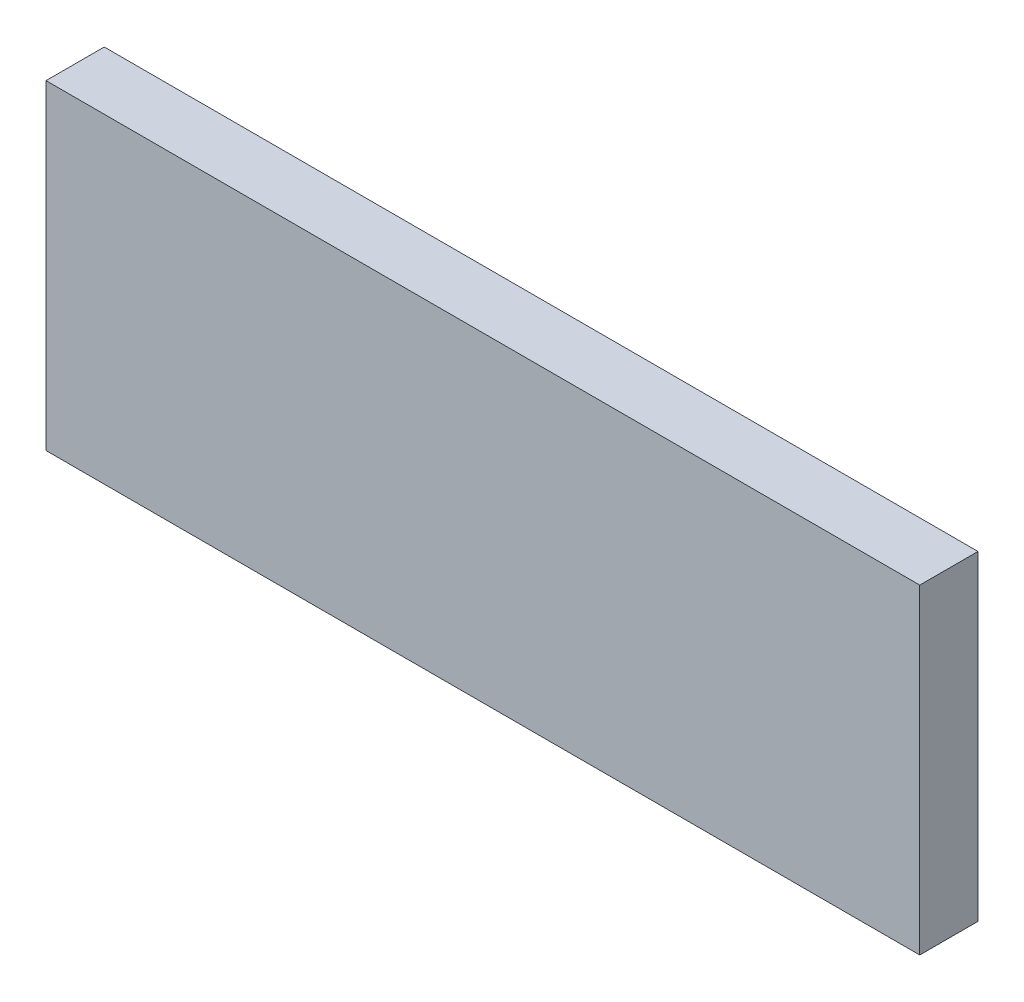
ISO-10303-21;
HEADER;
FILE_DESCRIPTION(('STEP AP214'),'2;1');
FILE_NAME('part.step','',(''),(''),'','','');
FILE_SCHEMA(('AUTOMOTIVE_DESIGN { 1 0 10303 214 1 1 1 1 }'));
ENDSEC;
DATA;
#1=APPLICATION_CONTEXT('core data for automotive mechanical design processes');
#2=APPLICATION_PROTOCOL_DEFINITION('international standard','automotive_design',2000,#1);
#3=PRODUCT_CONTEXT('',#1,'mechanical');
#4=PRODUCT('Part','Part','',(#3));
#5=PRODUCT_RELATED_PRODUCT_CATEGORY('part','',(#4));
#6=PRODUCT_DEFINITION_FORMATION('','',#4);
#7=PRODUCT_DEFINITION_CONTEXT('part definition',#1,'design');
#8=PRODUCT_DEFINITION('design','',#6,#7);
#9=PRODUCT_DEFINITION_SHAPE('','',#8);
#10=(LENGTH_UNIT() NAMED_UNIT(*) SI_UNIT(.MILLI.,.METRE.));
#11=(NAMED_UNIT(*) PLANE_ANGLE_UNIT() SI_UNIT($,.RADIAN.));
#12=(NAMED_UNIT(*) SI_UNIT($,.STERADIAN.) SOLID_ANGLE_UNIT());
#13=UNCERTAINTY_MEASURE_WITH_UNIT(LENGTH_MEASURE(1.E-05),#10,'distance_accuracy_value','');
#14=(GEOMETRIC_REPRESENTATION_CONTEXT(3) GLOBAL_UNCERTAINTY_ASSIGNED_CONTEXT((#13)) GLOBAL_UNIT_ASSIGNED_CONTEXT((#10,
#11,#12)) REPRESENTATION_CONTEXT('',''));
#15=CARTESIAN_POINT('',(0.,0.,0.));
#16=DIRECTION('',(0.,0.,1.));
#17=DIRECTION('',(1.,0.,0.));
#18=AXIS2_PLACEMENT_3D('',#15,#16,#17);
#19=CARTESIAN_POINT('',(-51.24,31.58,2.));
#20=DIRECTION('',(1.,0.,0.));
#21=DIRECTION('',(0.,1.,0.));
#22=AXIS2_PLACEMENT_3D('',#19,#20,#21);
#23=PLANE('',#22);
#24=DIRECTION('',(0.,-1.,0.));
#25=VECTOR('',#24,1.);
#26=CARTESIAN_POINT('',(-51.24,31.58,0.));
#27=LINE('',#26,#25);
#28=CARTESIAN_POINT('',(-51.24,31.58,0.));
#29=VERTEX_POINT('',#28);
#30=CARTESIAN_POINT('',(-51.24,20.58,0.));
#31=VERTEX_POINT('',#30);
#32=EDGE_CURVE('E96',#29,#31,#27,.T.);
#33=ORIENTED_EDGE('',*,*,#32,.T.);
#34=DIRECTION('',(0.,0.,-1.));
#35=VECTOR('',#34,1.);
#36=CARTESIAN_POINT('',(-51.24,20.58,2.));
#37=LINE('',#36,#35);
#38=CARTESIAN_POINT('',(-51.24,20.58,2.));
#39=VERTEX_POINT('',#38);
#40=EDGE_CURVE('E11',#39,#31,#37,.T.);
#41=ORIENTED_EDGE('',*,*,#40,.F.);
#42=DIRECTION('',(0.,-1.,0.));
#43=VECTOR('',#42,1.);
#44=CARTESIAN_POINT('',(-51.24,31.58,2.));
#45=LINE('',#44,#43);
#46=CARTESIAN_POINT('',(-51.24,31.58,2.));
#47=VERTEX_POINT('',#46);
#48=EDGE_CURVE('E84',#47,#39,#45,.T.);
#49=ORIENTED_EDGE('',*,*,#48,.F.);
#50=DIRECTION('',(0.,0.,-1.));
#51=VECTOR('',#50,1.);
#52=CARTESIAN_POINT('',(-51.24,31.58,2.));
#53=LINE('',#52,#51);
#54=EDGE_CURVE('E92',#47,#29,#53,.T.);
#55=ORIENTED_EDGE('',*,*,#54,.T.);
#56=EDGE_LOOP('',(#33,#41,#49,#55));
#57=FACE_BOUND('',#56,.T.);
#58=ADVANCED_FACE('F33',(#57),#23,.F.);
#59=CARTESIAN_POINT('',(-51.24,20.58,2.));
#60=DIRECTION('',(0.,1.,0.));
#61=DIRECTION('',(0.,0.,1.));
#62=AXIS2_PLACEMENT_3D('',#59,#60,#61);
#63=PLANE('',#62);
#64=DIRECTION('',(1.,0.,0.));
#65=VECTOR('',#64,1.);
#66=CARTESIAN_POINT('',(-51.24,20.58,0.));
#67=LINE('',#66,#65);
#68=CARTESIAN_POINT('',(-21.24,20.58,0.));
#69=VERTEX_POINT('',#68);
#70=EDGE_CURVE('E88',#31,#69,#67,.T.);
#71=ORIENTED_EDGE('',*,*,#70,.T.);
#72=DIRECTION('',(0.,0.,-1.));
#73=VECTOR('',#72,1.);
#74=CARTESIAN_POINT('',(-21.24,20.58,2.));
#75=LINE('',#74,#73);
#76=CARTESIAN_POINT('',(-21.24,20.58,2.));
#77=VERTEX_POINT('',#76);
#78=EDGE_CURVE('E41',#77,#69,#75,.T.);
#79=ORIENTED_EDGE('',*,*,#78,.F.);
#80=DIRECTION('',(1.,0.,0.));
#81=VECTOR('',#80,1.);
#82=CARTESIAN_POINT('',(-51.24,20.58,2.));
#83=LINE('',#82,#81);
#84=EDGE_CURVE('E79',#39,#77,#83,.T.);
#85=ORIENTED_EDGE('',*,*,#84,.F.);
#86=ORIENTED_EDGE('',*,*,#40,.T.);
#87=EDGE_LOOP('',(#71,#79,#85,#86));
#88=FACE_BOUND('',#87,.T.);
#89=ADVANCED_FACE('F87',(#88),#63,.F.);
#90=CARTESIAN_POINT('',(-21.24,31.58,2.));
#91=DIRECTION('',(-1.,0.,0.));
#92=DIRECTION('',(0.,0.,1.));
#93=AXIS2_PLACEMENT_3D('',#90,#91,#92);
#94=PLANE('',#93);
#95=DIRECTION('',(0.,1.,0.));
#96=VECTOR('',#95,1.);
#97=CARTESIAN_POINT('',(-21.24,31.58,0.));
#98=LINE('',#97,#96);
#99=CARTESIAN_POINT('',(-21.24,31.58,0.));
#100=VERTEX_POINT('',#99);
#101=EDGE_CURVE('E66',#69,#100,#98,.T.);
#102=ORIENTED_EDGE('',*,*,#101,.T.);
#103=DIRECTION('',(0.,0.,-1.));
#104=VECTOR('',#103,1.);
#105=CARTESIAN_POINT('',(-21.24,31.58,2.));
#106=LINE('',#105,#104);
#107=CARTESIAN_POINT('',(-21.24,31.58,2.));
#108=VERTEX_POINT('',#107);
#109=EDGE_CURVE('E89',#108,#100,#106,.T.);
#110=ORIENTED_EDGE('',*,*,#109,.F.);
#111=DIRECTION('',(0.,1.,0.));
#112=VECTOR('',#111,1.);
#113=CARTESIAN_POINT('',(-21.24,31.58,2.));
#114=LINE('',#113,#112);
#115=EDGE_CURVE('E82',#77,#108,#114,.T.);
#116=ORIENTED_EDGE('',*,*,#115,.F.);
#117=ORIENTED_EDGE('',*,*,#78,.T.);
#118=EDGE_LOOP('',(#102,#110,#116,#117));
#119=FACE_BOUND('',#118,.T.);
#120=ADVANCED_FACE('F90',(#119),#94,.F.);
#121=CARTESIAN_POINT('',(-51.24,31.58,2.));
#122=DIRECTION('',(0.,-1.,0.));
#123=DIRECTION('',(0.,0.,-1.));
#124=AXIS2_PLACEMENT_3D('',#121,#122,#123);
#125=PLANE('',#124);
#126=DIRECTION('',(-1.,0.,0.));
#127=VECTOR('',#126,1.);
#128=CARTESIAN_POINT('',(-51.24,31.58,0.));
#129=LINE('',#128,#127);
#130=EDGE_CURVE('E72',#100,#29,#129,.T.);
#131=ORIENTED_EDGE('',*,*,#130,.T.);
#132=ORIENTED_EDGE('',*,*,#54,.F.);
#133=DIRECTION('',(-1.,0.,0.));
#134=VECTOR('',#133,1.);
#135=CARTESIAN_POINT('',(-51.24,31.58,2.));
#136=LINE('',#135,#134);
#137=EDGE_CURVE('E49',#108,#47,#136,.T.);
#138=ORIENTED_EDGE('',*,*,#137,.F.);
#139=ORIENTED_EDGE('',*,*,#109,.T.);
#140=EDGE_LOOP('',(#131,#132,#138,#139));
#141=FACE_BOUND('',#140,.T.);
#142=ADVANCED_FACE('F103',(#141),#125,.F.);
#143=CARTESIAN_POINT('',(0.,0.,2.));
#144=DIRECTION('',(0.,0.,1.));
#145=DIRECTION('',(1.,0.,0.));
#146=AXIS2_PLACEMENT_3D('',#143,#144,#145);
#147=PLANE('',#146);
#148=ORIENTED_EDGE('',*,*,#48,.T.);
#149=ORIENTED_EDGE('',*,*,#84,.T.);
#150=ORIENTED_EDGE('',*,*,#115,.T.);
#151=ORIENTED_EDGE('',*,*,#137,.T.);
#152=EDGE_LOOP('',(#148,#149,#150,#151));
#153=FACE_BOUND('',#152,.T.);
#154=ADVANCED_FACE('F80',(#153),#147,.T.);
#155=CARTESIAN_POINT('',(0.,0.,0.));
#156=DIRECTION('',(0.,0.,1.));
#157=DIRECTION('',(1.,0.,0.));
#158=AXIS2_PLACEMENT_3D('',#155,#156,#157);
#159=PLANE('',#158);
#160=ORIENTED_EDGE('',*,*,#32,.F.);
#161=ORIENTED_EDGE('',*,*,#130,.F.);
#162=ORIENTED_EDGE('',*,*,#101,.F.);
#163=ORIENTED_EDGE('',*,*,#70,.F.);
#164=EDGE_LOOP('',(#160,#161,#162,#163));
#165=FACE_BOUND('',#164,.T.);
#166=ADVANCED_FACE('F106',(#165),#159,.F.);
#167=CLOSED_SHELL('',(#58,#89,#120,#142,#154,#166));
#168=MANIFOLD_SOLID_BREP('B2',#167);
#169=ADVANCED_BREP_SHAPE_REPRESENTATION('',(#18,#168),#14);
#170=SHAPE_DEFINITION_REPRESENTATION(#9,#169);
ENDSEC;
END-ISO-10303-21;
